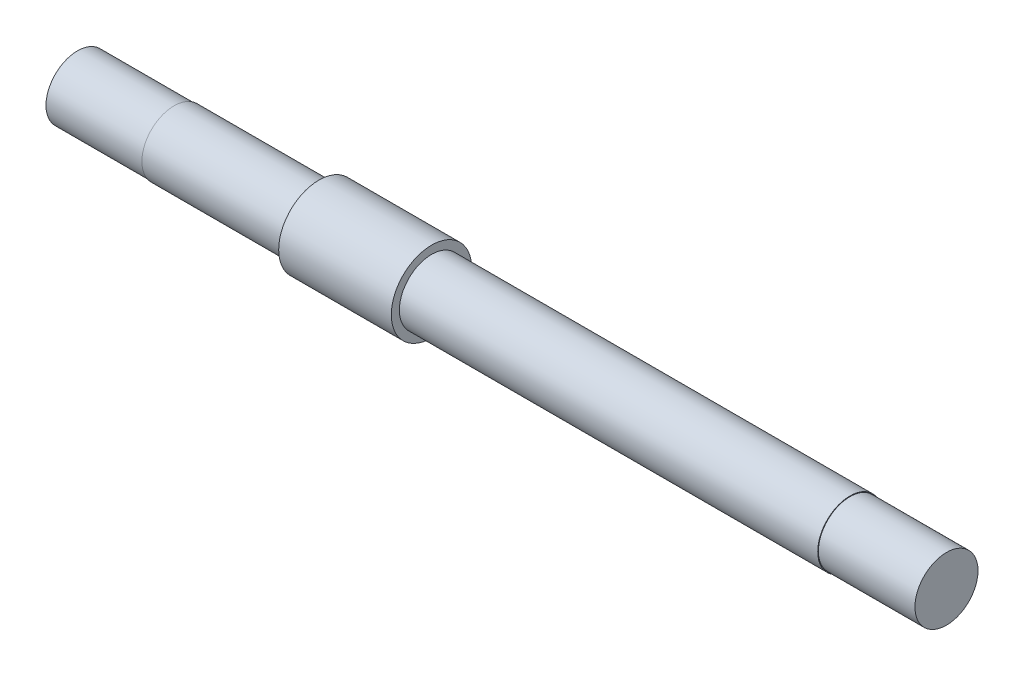
ISO-10303-21;
HEADER;
FILE_DESCRIPTION(('STEP AP214'),'2;1');
FILE_NAME('part.step','',(''),(''),'','','');
FILE_SCHEMA(('AUTOMOTIVE_DESIGN { 1 0 10303 214 1 1 1 1 }'));
ENDSEC;
DATA;
#1=APPLICATION_CONTEXT('core data for automotive mechanical design processes');
#2=APPLICATION_PROTOCOL_DEFINITION('international standard','automotive_design',2000,#1);
#3=PRODUCT_CONTEXT('',#1,'mechanical');
#4=PRODUCT('Part','Part','',(#3));
#5=PRODUCT_RELATED_PRODUCT_CATEGORY('part','',(#4));
#6=PRODUCT_DEFINITION_FORMATION('','',#4);
#7=PRODUCT_DEFINITION_CONTEXT('part definition',#1,'design');
#8=PRODUCT_DEFINITION('design','',#6,#7);
#9=PRODUCT_DEFINITION_SHAPE('','',#8);
#10=(LENGTH_UNIT() NAMED_UNIT(*) SI_UNIT(.MILLI.,.METRE.));
#11=(NAMED_UNIT(*) PLANE_ANGLE_UNIT() SI_UNIT($,.RADIAN.));
#12=(NAMED_UNIT(*) SI_UNIT($,.STERADIAN.) SOLID_ANGLE_UNIT());
#13=UNCERTAINTY_MEASURE_WITH_UNIT(LENGTH_MEASURE(1.E-05),#10,'distance_accuracy_value','');
#14=(GEOMETRIC_REPRESENTATION_CONTEXT(3) GLOBAL_UNCERTAINTY_ASSIGNED_CONTEXT((#13)) GLOBAL_UNIT_ASSIGNED_CONTEXT((#10,
#11,#12)) REPRESENTATION_CONTEXT('',''));
#15=CARTESIAN_POINT('',(0.,0.,0.));
#16=DIRECTION('',(0.,0.,1.));
#17=DIRECTION('',(1.,0.,0.));
#18=AXIS2_PLACEMENT_3D('',#15,#16,#17);
#19=CARTESIAN_POINT('',(15.875,0.,0.));
#20=DIRECTION('',(-1.,0.,0.));
#21=DIRECTION('',(0.,0.,1.));
#22=AXIS2_PLACEMENT_3D('',#19,#20,#21);
#23=CYLINDRICAL_SURFACE('',#22,6.35);
#24=CARTESIAN_POINT('',(-15.875,0.,0.));
#25=DIRECTION('',(-1.,0.,0.));
#26=DIRECTION('',(0.,0.,1.));
#27=AXIS2_PLACEMENT_3D('',#24,#25,#26);
#28=CIRCLE('',#27,6.35);
#29=CARTESIAN_POINT('',(-15.875,0.,6.35));
#30=VERTEX_POINT('',#29);
#31=EDGE_CURVE('E11',#30,#30,#28,.T.);
#32=ORIENTED_EDGE('',*,*,#31,.F.);
#33=EDGE_LOOP('',(#32));
#34=FACE_BOUND('',#33,.T.);
#35=CARTESIAN_POINT('',(66.675,0.,0.));
#36=DIRECTION('',(1.,0.,0.));
#37=DIRECTION('',(0.,0.,-1.));
#38=AXIS2_PLACEMENT_3D('',#35,#36,#37);
#39=CIRCLE('',#38,6.35);
#40=CARTESIAN_POINT('',(66.675,0.,-6.35));
#41=VERTEX_POINT('',#40);
#42=EDGE_CURVE('E37',#41,#41,#39,.T.);
#43=ORIENTED_EDGE('',*,*,#42,.F.);
#44=EDGE_LOOP('',(#43));
#45=FACE_BOUND('',#44,.T.);
#46=ADVANCED_FACE('F34',(#34,#45),#23,.T.);
#47=CARTESIAN_POINT('',(-85.725,0.,0.));
#48=DIRECTION('',(1.,0.,0.));
#49=DIRECTION('',(0.,0.,-1.));
#50=AXIS2_PLACEMENT_3D('',#47,#48,#49);
#51=CYLINDRICAL_SURFACE('',#50,6.35);
#52=CARTESIAN_POINT('',(-38.1,0.,0.));
#53=DIRECTION('',(-1.,0.,0.));
#54=DIRECTION('',(0.,0.,1.));
#55=AXIS2_PLACEMENT_3D('',#52,#53,#54);
#56=CIRCLE('',#55,6.35);
#57=CARTESIAN_POINT('',(-38.1,0.,6.35));
#58=VERTEX_POINT('',#57);
#59=EDGE_CURVE('E51',#58,#58,#56,.T.);
#60=ORIENTED_EDGE('',*,*,#59,.T.);
#61=EDGE_LOOP('',(#60));
#62=FACE_BOUND('',#61,.T.);
#63=CARTESIAN_POINT('',(-66.675,0.,0.));
#64=DIRECTION('',(-1.,0.,0.));
#65=DIRECTION('',(0.,0.,1.));
#66=AXIS2_PLACEMENT_3D('',#63,#64,#65);
#67=CIRCLE('',#66,6.35);
#68=CARTESIAN_POINT('',(-66.675,0.,6.35));
#69=VERTEX_POINT('',#68);
#70=EDGE_CURVE('E49',#69,#69,#67,.T.);
#71=ORIENTED_EDGE('',*,*,#70,.F.);
#72=EDGE_LOOP('',(#71));
#73=FACE_BOUND('',#72,.T.);
#74=ADVANCED_FACE('F78',(#62,#73),#51,.T.);
#75=CARTESIAN_POINT('',(-38.1,0.,0.));
#76=DIRECTION('',(-1.,0.,0.));
#77=DIRECTION('',(0.,0.,1.));
#78=AXIS2_PLACEMENT_3D('',#75,#76,#77);
#79=PLANE('',#78);
#80=CARTESIAN_POINT('',(-38.1,0.,0.));
#81=DIRECTION('',(-1.,0.,0.));
#82=DIRECTION('',(0.,0.,1.));
#83=AXIS2_PLACEMENT_3D('',#80,#81,#82);
#84=CIRCLE('',#83,7.9375);
#85=CARTESIAN_POINT('',(-38.1,0.,7.9375));
#86=VERTEX_POINT('',#85);
#87=EDGE_CURVE('E41',#86,#86,#84,.T.);
#88=ORIENTED_EDGE('',*,*,#87,.T.);
#89=EDGE_LOOP('',(#88));
#90=FACE_BOUND('',#89,.T.);
#91=ORIENTED_EDGE('',*,*,#59,.F.);
#92=EDGE_LOOP('',(#91));
#93=FACE_BOUND('',#92,.T.);
#94=ADVANCED_FACE('F83',(#90,#93),#79,.T.);
#95=CARTESIAN_POINT('',(-15.875,0.,0.));
#96=DIRECTION('',(-1.,0.,0.));
#97=DIRECTION('',(0.,0.,1.));
#98=AXIS2_PLACEMENT_3D('',#95,#96,#97);
#99=PLANE('',#98);
#100=CARTESIAN_POINT('',(-15.875,0.,0.));
#101=DIRECTION('',(-1.,0.,0.));
#102=DIRECTION('',(0.,0.,1.));
#103=AXIS2_PLACEMENT_3D('',#100,#101,#102);
#104=CIRCLE('',#103,7.9375);
#105=CARTESIAN_POINT('',(-15.875,0.,7.9375));
#106=VERTEX_POINT('',#105);
#107=EDGE_CURVE('E46',#106,#106,#104,.T.);
#108=ORIENTED_EDGE('',*,*,#107,.F.);
#109=EDGE_LOOP('',(#108));
#110=FACE_BOUND('',#109,.T.);
#111=ORIENTED_EDGE('',*,*,#31,.T.);
#112=EDGE_LOOP('',(#111));
#113=FACE_BOUND('',#112,.T.);
#114=ADVANCED_FACE('F89',(#110,#113),#99,.F.);
#115=CARTESIAN_POINT('',(-38.1,0.,0.));
#116=DIRECTION('',(1.,0.,0.));
#117=DIRECTION('',(0.,0.,-1.));
#118=AXIS2_PLACEMENT_3D('',#115,#116,#117);
#119=CYLINDRICAL_SURFACE('',#118,7.9375);
#120=ORIENTED_EDGE('',*,*,#87,.F.);
#121=EDGE_LOOP('',(#120));
#122=FACE_BOUND('',#121,.T.);
#123=ORIENTED_EDGE('',*,*,#107,.T.);
#124=EDGE_LOOP('',(#123));
#125=FACE_BOUND('',#124,.T.);
#126=ADVANCED_FACE('F103',(#122,#125),#119,.T.);
#127=CARTESIAN_POINT('',(-66.675,0.,0.));
#128=DIRECTION('',(-1.,0.,0.));
#129=DIRECTION('',(0.,0.,1.));
#130=AXIS2_PLACEMENT_3D('',#127,#128,#129);
#131=PLANE('',#130);
#132=CARTESIAN_POINT('',(-66.675,0.,0.));
#133=DIRECTION('',(-1.,0.,0.));
#134=DIRECTION('',(0.,0.,1.));
#135=AXIS2_PLACEMENT_3D('',#132,#133,#134);
#136=CIRCLE('',#135,6.223);
#137=CARTESIAN_POINT('',(-66.675,0.,6.223));
#138=VERTEX_POINT('',#137);
#139=EDGE_CURVE('E52',#138,#138,#136,.T.);
#140=ORIENTED_EDGE('',*,*,#139,.F.);
#141=EDGE_LOOP('',(#140));
#142=FACE_BOUND('',#141,.T.);
#143=ORIENTED_EDGE('',*,*,#70,.T.);
#144=EDGE_LOOP('',(#143));
#145=FACE_BOUND('',#144,.T.);
#146=ADVANCED_FACE('F106',(#142,#145),#131,.T.);
#147=CARTESIAN_POINT('',(-66.675,0.,0.));
#148=DIRECTION('',(-1.,0.,0.));
#149=DIRECTION('',(0.,0.,1.));
#150=AXIS2_PLACEMENT_3D('',#147,#148,#149);
#151=CYLINDRICAL_SURFACE('',#150,6.223);
#152=CARTESIAN_POINT('',(-85.725,0.,0.));
#153=DIRECTION('',(-1.,0.,0.));
#154=DIRECTION('',(0.,0.,1.));
#155=AXIS2_PLACEMENT_3D('',#152,#153,#154);
#156=CIRCLE('',#155,6.223);
#157=CARTESIAN_POINT('',(-85.725,0.,6.223));
#158=VERTEX_POINT('',#157);
#159=EDGE_CURVE('E58',#158,#158,#156,.T.);
#160=CARTESIAN_POINT('',(-66.675,0.,6.223));
#161=CARTESIAN_POINT('',(-66.8734375,0.,6.223));
#162=CARTESIAN_POINT('',(-67.071875,0.,6.223));
#163=CARTESIAN_POINT('',(-67.46875,0.,6.223));
#164=CARTESIAN_POINT('',(-67.6671875,0.,6.223));
#165=CARTESIAN_POINT('',(-68.0640625,0.,6.223));
#166=CARTESIAN_POINT('',(-68.2625,0.,6.223));
#167=CARTESIAN_POINT('',(-68.659375,0.,6.223));
#168=CARTESIAN_POINT('',(-68.8578125,0.,6.223));
#169=CARTESIAN_POINT('',(-69.2546875,0.,6.223));
#170=CARTESIAN_POINT('',(-69.453125,0.,6.223));
#171=CARTESIAN_POINT('',(-69.85,0.,6.223));
#172=CARTESIAN_POINT('',(-70.0484375,0.,6.223));
#173=CARTESIAN_POINT('',(-70.4453125,0.,6.223));
#174=CARTESIAN_POINT('',(-70.64375,0.,6.223));
#175=CARTESIAN_POINT('',(-71.040625,0.,6.223));
#176=CARTESIAN_POINT('',(-71.2390625,0.,6.223));
#177=CARTESIAN_POINT('',(-71.6359375,0.,6.223));
#178=CARTESIAN_POINT('',(-71.834375,0.,6.223));
#179=CARTESIAN_POINT('',(-72.23125,0.,6.223));
#180=CARTESIAN_POINT('',(-72.4296875,0.,6.223));
#181=CARTESIAN_POINT('',(-72.8265625,0.,6.223));
#182=CARTESIAN_POINT('',(-73.025,0.,6.223));
#183=CARTESIAN_POINT('',(-73.421875,0.,6.223));
#184=CARTESIAN_POINT('',(-73.6203125,0.,6.223));
#185=CARTESIAN_POINT('',(-74.0171875,0.,6.223));
#186=CARTESIAN_POINT('',(-74.215625,0.,6.223));
#187=CARTESIAN_POINT('',(-74.6125,0.,6.223));
#188=CARTESIAN_POINT('',(-74.8109375,0.,6.223));
#189=CARTESIAN_POINT('',(-75.2078125,0.,6.223));
#190=CARTESIAN_POINT('',(-75.40625,0.,6.223));
#191=CARTESIAN_POINT('',(-75.803125,0.,6.223));
#192=CARTESIAN_POINT('',(-76.0015625,0.,6.223));
#193=CARTESIAN_POINT('',(-76.3984375,0.,6.223));
#194=CARTESIAN_POINT('',(-76.596875,0.,6.223));
#195=CARTESIAN_POINT('',(-76.99375,0.,6.223));
#196=CARTESIAN_POINT('',(-77.1921875,0.,6.223));
#197=CARTESIAN_POINT('',(-77.5890625,0.,6.223));
#198=CARTESIAN_POINT('',(-77.7875,0.,6.223));
#199=CARTESIAN_POINT('',(-78.184375,0.,6.223));
#200=CARTESIAN_POINT('',(-78.3828125,0.,6.223));
#201=CARTESIAN_POINT('',(-78.7796875,0.,6.223));
#202=CARTESIAN_POINT('',(-78.978125,0.,6.223));
#203=CARTESIAN_POINT('',(-79.375,0.,6.223));
#204=CARTESIAN_POINT('',(-79.5734375,0.,6.223));
#205=CARTESIAN_POINT('',(-79.9703125,0.,6.223));
#206=CARTESIAN_POINT('',(-80.16875,0.,6.223));
#207=CARTESIAN_POINT('',(-80.565625,0.,6.223));
#208=CARTESIAN_POINT('',(-80.7640625,0.,6.223));
#209=CARTESIAN_POINT('',(-81.1609375,0.,6.223));
#210=CARTESIAN_POINT('',(-81.359375,0.,6.223));
#211=CARTESIAN_POINT('',(-81.75625,0.,6.223));
#212=CARTESIAN_POINT('',(-81.9546875,0.,6.223));
#213=CARTESIAN_POINT('',(-82.3515625,0.,6.223));
#214=CARTESIAN_POINT('',(-82.55,0.,6.223));
#215=CARTESIAN_POINT('',(-82.946875,0.,6.223));
#216=CARTESIAN_POINT('',(-83.1453125,0.,6.223));
#217=CARTESIAN_POINT('',(-83.5421875,0.,6.223));
#218=CARTESIAN_POINT('',(-83.740625,0.,6.223));
#219=CARTESIAN_POINT('',(-84.1375,0.,6.223));
#220=CARTESIAN_POINT('',(-84.3359375,0.,6.223));
#221=CARTESIAN_POINT('',(-84.7328125,0.,6.223));
#222=CARTESIAN_POINT('',(-84.93125,0.,6.223));
#223=CARTESIAN_POINT('',(-85.328125,0.,6.223));
#224=CARTESIAN_POINT('',(-85.5265625,0.,6.223));
#225=CARTESIAN_POINT('',(-85.725,0.,6.223));
#226=B_SPLINE_CURVE_WITH_KNOTS('',3,(#160,#161,#162,#163,#164,#165,#166,#167,#168,#169,#170,
#171,#172,#173,#174,#175,#176,#177,#178,#179,#180,#181,#182,#183,#184,#185,#186,#187,#188,#189,
#190,#191,#192,#193,#194,#195,#196,#197,#198,#199,#200,#201,#202,#203,#204,#205,#206,#207,#208,
#209,#210,#211,#212,#213,#214,#215,#216,#217,#218,#219,#220,#221,#222,#223,#224,#225),
.UNSPECIFIED.,.F.,.F.,(4,2,2,2,2,2,2,2,2,2,2,2,2,2,2,2,2,2,2,2,2,2,2,2,2,2,2,2,2,2,2,2,4),(0.,
0.5953125,1.190625,1.7859375,2.38125,2.9765625,3.571875,4.1671875,4.7625,5.3578125,5.953125,
6.5484375,7.14375,7.7390625,8.334375,8.92968750000001,9.52500000000001,10.1203125,10.715625,
11.3109375,11.90625,12.5015625,13.096875,13.6921875,14.2875,14.8828125,15.478125,16.0734375,
16.66875,17.2640625,17.859375,18.4546875,19.05),.UNSPECIFIED.);
#227=EDGE_CURVE('BSEAM111',#138,#158,#226,.T.);
#228=ORIENTED_EDGE('',*,*,#139,.T.);
#229=ORIENTED_EDGE('',*,*,#159,.F.);
#230=ORIENTED_EDGE('',*,*,#227,.T.);
#231=ORIENTED_EDGE('',*,*,#227,.F.);
#232=EDGE_LOOP('',(#228,#230,#229,#231));
#233=FACE_BOUND('',#232,.T.);
#234=ADVANCED_FACE('F111',(#233),#151,.T.);
#235=CARTESIAN_POINT('',(-85.725,0.,0.));
#236=DIRECTION('',(-1.,0.,0.));
#237=DIRECTION('',(0.,0.,1.));
#238=AXIS2_PLACEMENT_3D('',#235,#236,#237);
#239=PLANE('',#238);
#240=ORIENTED_EDGE('',*,*,#159,.T.);
#241=EDGE_LOOP('',(#240));
#242=FACE_BOUND('',#241,.T.);
#243=ADVANCED_FACE('F95',(#242),#239,.T.);
#244=CARTESIAN_POINT('',(66.675,0.,0.));
#245=DIRECTION('',(1.,0.,0.));
#246=DIRECTION('',(0.,0.,-1.));
#247=AXIS2_PLACEMENT_3D('',#244,#245,#246);
#248=PLANE('',#247);
#249=CARTESIAN_POINT('',(66.675,0.,0.));
#250=DIRECTION('',(1.,0.,0.));
#251=DIRECTION('',(0.,0.,-1.));
#252=AXIS2_PLACEMENT_3D('',#249,#250,#251);
#253=CIRCLE('',#252,6.223);
#254=CARTESIAN_POINT('',(66.675,0.,-6.223));
#255=VERTEX_POINT('',#254);
#256=EDGE_CURVE('E68',#255,#255,#253,.T.);
#257=ORIENTED_EDGE('',*,*,#256,.F.);
#258=EDGE_LOOP('',(#257));
#259=FACE_BOUND('',#258,.T.);
#260=ORIENTED_EDGE('',*,*,#42,.T.);
#261=EDGE_LOOP('',(#260));
#262=FACE_BOUND('',#261,.T.);
#263=ADVANCED_FACE('F75',(#259,#262),#248,.T.);
#264=CARTESIAN_POINT('',(66.675,0.,0.));
#265=DIRECTION('',(1.,0.,0.));
#266=DIRECTION('',(0.,0.,-1.));
#267=AXIS2_PLACEMENT_3D('',#264,#265,#266);
#268=CYLINDRICAL_SURFACE('',#267,6.223);
#269=CARTESIAN_POINT('',(85.725,0.,0.));
#270=DIRECTION('',(1.,0.,0.));
#271=DIRECTION('',(0.,0.,-1.));
#272=AXIS2_PLACEMENT_3D('',#269,#270,#271);
#273=CIRCLE('',#272,6.223);
#274=CARTESIAN_POINT('',(85.725,0.,-6.223));
#275=VERTEX_POINT('',#274);
#276=EDGE_CURVE('E65',#275,#275,#273,.T.);
#277=CARTESIAN_POINT('',(66.675,0.,-6.223));
#278=CARTESIAN_POINT('',(66.8734375,0.,-6.223));
#279=CARTESIAN_POINT('',(67.071875,0.,-6.223));
#280=CARTESIAN_POINT('',(67.46875,0.,-6.223));
#281=CARTESIAN_POINT('',(67.6671875,0.,-6.223));
#282=CARTESIAN_POINT('',(68.0640625,0.,-6.223));
#283=CARTESIAN_POINT('',(68.2625,0.,-6.223));
#284=CARTESIAN_POINT('',(68.659375,0.,-6.223));
#285=CARTESIAN_POINT('',(68.8578125,0.,-6.223));
#286=CARTESIAN_POINT('',(69.2546875,0.,-6.223));
#287=CARTESIAN_POINT('',(69.453125,0.,-6.223));
#288=CARTESIAN_POINT('',(69.85,0.,-6.223));
#289=CARTESIAN_POINT('',(70.0484375,0.,-6.223));
#290=CARTESIAN_POINT('',(70.4453125,0.,-6.223));
#291=CARTESIAN_POINT('',(70.64375,0.,-6.223));
#292=CARTESIAN_POINT('',(71.040625,0.,-6.223));
#293=CARTESIAN_POINT('',(71.2390625,0.,-6.223));
#294=CARTESIAN_POINT('',(71.6359375,0.,-6.223));
#295=CARTESIAN_POINT('',(71.834375,0.,-6.223));
#296=CARTESIAN_POINT('',(72.23125,0.,-6.223));
#297=CARTESIAN_POINT('',(72.4296875,0.,-6.223));
#298=CARTESIAN_POINT('',(72.8265625,0.,-6.223));
#299=CARTESIAN_POINT('',(73.025,0.,-6.223));
#300=CARTESIAN_POINT('',(73.421875,0.,-6.223));
#301=CARTESIAN_POINT('',(73.6203125,0.,-6.223));
#302=CARTESIAN_POINT('',(74.0171875,0.,-6.223));
#303=CARTESIAN_POINT('',(74.215625,0.,-6.223));
#304=CARTESIAN_POINT('',(74.6125,0.,-6.223));
#305=CARTESIAN_POINT('',(74.8109375,0.,-6.223));
#306=CARTESIAN_POINT('',(75.2078125,0.,-6.223));
#307=CARTESIAN_POINT('',(75.40625,0.,-6.223));
#308=CARTESIAN_POINT('',(75.803125,0.,-6.223));
#309=CARTESIAN_POINT('',(76.0015625,0.,-6.223));
#310=CARTESIAN_POINT('',(76.3984375,0.,-6.223));
#311=CARTESIAN_POINT('',(76.596875,0.,-6.223));
#312=CARTESIAN_POINT('',(76.99375,0.,-6.223));
#313=CARTESIAN_POINT('',(77.1921875,0.,-6.223));
#314=CARTESIAN_POINT('',(77.5890625,0.,-6.223));
#315=CARTESIAN_POINT('',(77.7875,0.,-6.223));
#316=CARTESIAN_POINT('',(78.184375,0.,-6.223));
#317=CARTESIAN_POINT('',(78.3828125,0.,-6.223));
#318=CARTESIAN_POINT('',(78.7796875,0.,-6.223));
#319=CARTESIAN_POINT('',(78.978125,0.,-6.223));
#320=CARTESIAN_POINT('',(79.375,0.,-6.223));
#321=CARTESIAN_POINT('',(79.5734375,0.,-6.223));
#322=CARTESIAN_POINT('',(79.9703125,0.,-6.223));
#323=CARTESIAN_POINT('',(80.16875,0.,-6.223));
#324=CARTESIAN_POINT('',(80.565625,0.,-6.223));
#325=CARTESIAN_POINT('',(80.7640625,0.,-6.223));
#326=CARTESIAN_POINT('',(81.1609375,0.,-6.223));
#327=CARTESIAN_POINT('',(81.359375,0.,-6.223));
#328=CARTESIAN_POINT('',(81.75625,0.,-6.223));
#329=CARTESIAN_POINT('',(81.9546875,0.,-6.223));
#330=CARTESIAN_POINT('',(82.3515625,0.,-6.223));
#331=CARTESIAN_POINT('',(82.55,0.,-6.223));
#332=CARTESIAN_POINT('',(82.946875,0.,-6.223));
#333=CARTESIAN_POINT('',(83.1453125,0.,-6.223));
#334=CARTESIAN_POINT('',(83.5421875,0.,-6.223));
#335=CARTESIAN_POINT('',(83.740625,0.,-6.223));
#336=CARTESIAN_POINT('',(84.1375,0.,-6.223));
#337=CARTESIAN_POINT('',(84.3359375,0.,-6.223));
#338=CARTESIAN_POINT('',(84.7328125,0.,-6.223));
#339=CARTESIAN_POINT('',(84.93125,0.,-6.223));
#340=CARTESIAN_POINT('',(85.328125,0.,-6.223));
#341=CARTESIAN_POINT('',(85.5265625,0.,-6.223));
#342=CARTESIAN_POINT('',(85.725,0.,-6.223));
#343=B_SPLINE_CURVE_WITH_KNOTS('',3,(#277,#278,#279,#280,#281,#282,#283,#284,#285,#286,#287,
#288,#289,#290,#291,#292,#293,#294,#295,#296,#297,#298,#299,#300,#301,#302,#303,#304,#305,#306,
#307,#308,#309,#310,#311,#312,#313,#314,#315,#316,#317,#318,#319,#320,#321,#322,#323,#324,#325,
#326,#327,#328,#329,#330,#331,#332,#333,#334,#335,#336,#337,#338,#339,#340,#341,#342),
.UNSPECIFIED.,.F.,.F.,(4,2,2,2,2,2,2,2,2,2,2,2,2,2,2,2,2,2,2,2,2,2,2,2,2,2,2,2,2,2,2,2,4),(0.,
0.5953125,1.190625,1.7859375,2.38125,2.9765625,3.571875,4.1671875,4.7625,5.3578125,5.953125,
6.5484375,7.14375,7.7390625,8.334375,8.92968750000001,9.52500000000001,10.1203125,10.715625,
11.3109375,11.90625,12.5015625,13.096875,13.6921875,14.2875,14.8828125,15.478125,16.0734375,
16.66875,17.2640625,17.859375,18.4546875,19.05),.UNSPECIFIED.);
#344=EDGE_CURVE('BSEAM99',#255,#275,#343,.T.);
#345=ORIENTED_EDGE('',*,*,#256,.T.);
#346=ORIENTED_EDGE('',*,*,#276,.F.);
#347=ORIENTED_EDGE('',*,*,#344,.T.);
#348=ORIENTED_EDGE('',*,*,#344,.F.);
#349=EDGE_LOOP('',(#345,#347,#346,#348));
#350=FACE_BOUND('',#349,.T.);
#351=ADVANCED_FACE('F99',(#350),#268,.T.);
#352=CARTESIAN_POINT('',(85.725,0.,0.));
#353=DIRECTION('',(1.,0.,0.));
#354=DIRECTION('',(0.,0.,-1.));
#355=AXIS2_PLACEMENT_3D('',#352,#353,#354);
#356=PLANE('',#355);
#357=ORIENTED_EDGE('',*,*,#276,.T.);
#358=EDGE_LOOP('',(#357));
#359=FACE_BOUND('',#358,.T.);
#360=ADVANCED_FACE('F97',(#359),#356,.T.);
#361=CLOSED_SHELL('',(#46,#74,#94,#114,#126,#146,#234,#243,#263,#351,#360));
#362=MANIFOLD_SOLID_BREP('B2',#361);
#363=ADVANCED_BREP_SHAPE_REPRESENTATION('',(#18,#362),#14);
#364=SHAPE_DEFINITION_REPRESENTATION(#9,#363);
ENDSEC;
END-ISO-10303-21;
